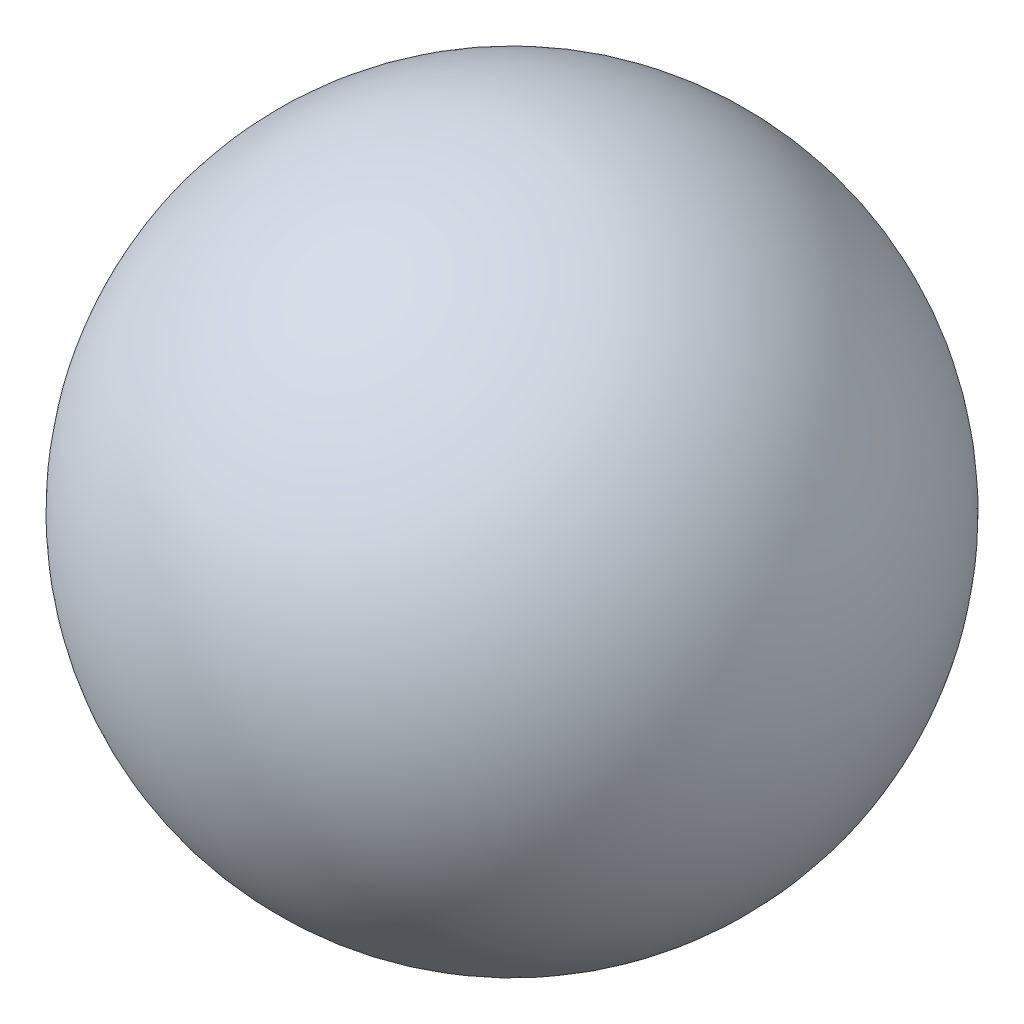
ISO-10303-21;
HEADER;
FILE_DESCRIPTION(('STEP AP214'),'2;1');
FILE_NAME('part.step','',(''),(''),'','','');
FILE_SCHEMA(('AUTOMOTIVE_DESIGN { 1 0 10303 214 1 1 1 1 }'));
ENDSEC;
DATA;
#1=APPLICATION_CONTEXT('core data for automotive mechanical design processes');
#2=APPLICATION_PROTOCOL_DEFINITION('international standard','automotive_design',2000,#1);
#3=PRODUCT_CONTEXT('',#1,'mechanical');
#4=PRODUCT('Part','Part','',(#3));
#5=PRODUCT_RELATED_PRODUCT_CATEGORY('part','',(#4));
#6=PRODUCT_DEFINITION_FORMATION('','',#4);
#7=PRODUCT_DEFINITION_CONTEXT('part definition',#1,'design');
#8=PRODUCT_DEFINITION('design','',#6,#7);
#9=PRODUCT_DEFINITION_SHAPE('','',#8);
#10=(LENGTH_UNIT() NAMED_UNIT(*) SI_UNIT(.MILLI.,.METRE.));
#11=(NAMED_UNIT(*) PLANE_ANGLE_UNIT() SI_UNIT($,.RADIAN.));
#12=(NAMED_UNIT(*) SI_UNIT($,.STERADIAN.) SOLID_ANGLE_UNIT());
#13=UNCERTAINTY_MEASURE_WITH_UNIT(LENGTH_MEASURE(1.E-05),#10,'distance_accuracy_value','');
#14=(GEOMETRIC_REPRESENTATION_CONTEXT(3) GLOBAL_UNCERTAINTY_ASSIGNED_CONTEXT((#13)) GLOBAL_UNIT_ASSIGNED_CONTEXT((#10,
#11,#12)) REPRESENTATION_CONTEXT('',''));
#15=CARTESIAN_POINT('',(0.,0.,0.));
#16=DIRECTION('',(0.,0.,1.));
#17=DIRECTION('',(1.,0.,0.));
#18=AXIS2_PLACEMENT_3D('',#15,#16,#17);
#19=CARTESIAN_POINT('',(0.,0.,0.));
#20=DIRECTION('',(-1.,0.,0.));
#21=DIRECTION('',(0.,0.,-1.));
#22=AXIS2_PLACEMENT_3D('',#19,#20,#21);
#23=SPHERICAL_SURFACE('',#22,8.);
#24=CARTESIAN_POINT('',(-8.,0.,0.));
#25=VERTEX_POINT('',#24);
#26=VERTEX_LOOP('',#25);
#27=FACE_BOUND('',#26,.T.);
#28=ADVANCED_FACE('F33',(#27),#23,.T.);
#29=CLOSED_SHELL('',(#28));
#30=MANIFOLD_SOLID_BREP('B2',#29);
#31=ADVANCED_BREP_SHAPE_REPRESENTATION('',(#18,#30),#14);
#32=SHAPE_DEFINITION_REPRESENTATION(#9,#31);
ENDSEC;
END-ISO-10303-21;
